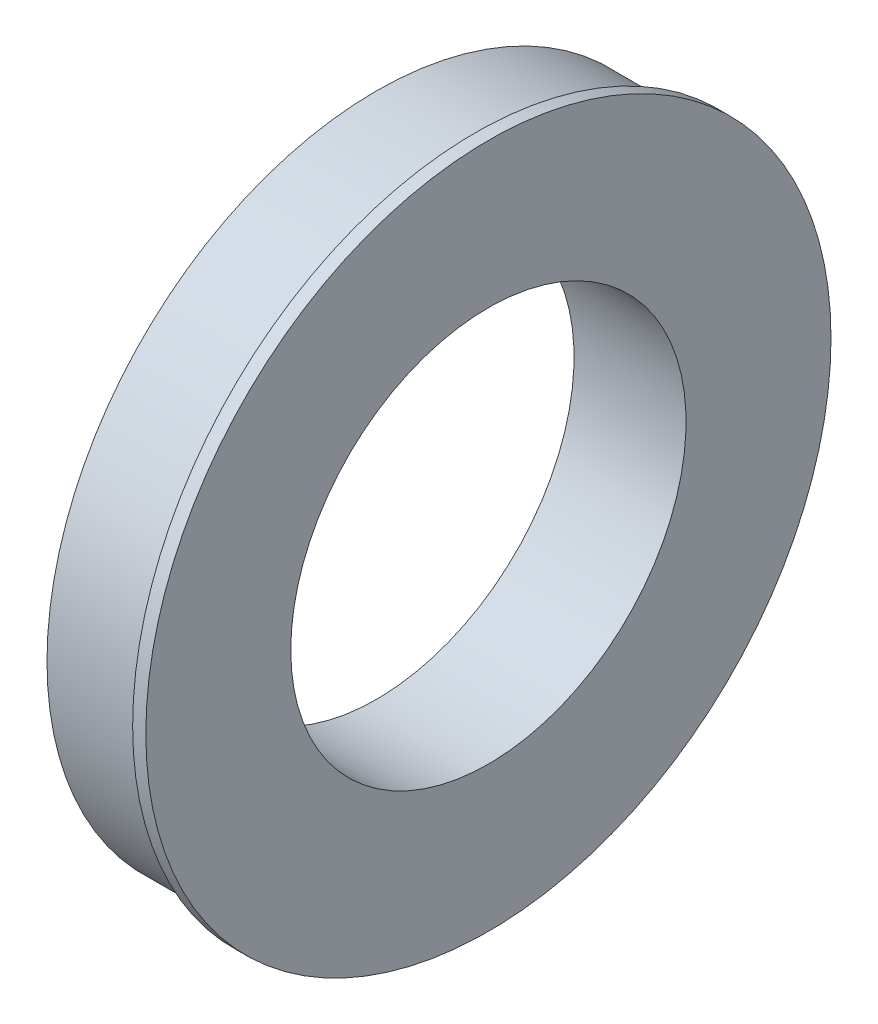
ISO-10303-21;
HEADER;
FILE_DESCRIPTION(('STEP AP214'),'2;1');
FILE_NAME('part.step','',(''),(''),'','','');
FILE_SCHEMA(('AUTOMOTIVE_DESIGN { 1 0 10303 214 1 1 1 1 }'));
ENDSEC;
DATA;
#1=APPLICATION_CONTEXT('core data for automotive mechanical design processes');
#2=APPLICATION_PROTOCOL_DEFINITION('international standard','automotive_design',2000,#1);
#3=PRODUCT_CONTEXT('',#1,'mechanical');
#4=PRODUCT('Part','Part','',(#3));
#5=PRODUCT_RELATED_PRODUCT_CATEGORY('part','',(#4));
#6=PRODUCT_DEFINITION_FORMATION('','',#4);
#7=PRODUCT_DEFINITION_CONTEXT('part definition',#1,'design');
#8=PRODUCT_DEFINITION('design','',#6,#7);
#9=PRODUCT_DEFINITION_SHAPE('','',#8);
#10=(LENGTH_UNIT() NAMED_UNIT(*) SI_UNIT(.MILLI.,.METRE.));
#11=(NAMED_UNIT(*) PLANE_ANGLE_UNIT() SI_UNIT($,.RADIAN.));
#12=(NAMED_UNIT(*) SI_UNIT($,.STERADIAN.) SOLID_ANGLE_UNIT());
#13=UNCERTAINTY_MEASURE_WITH_UNIT(LENGTH_MEASURE(1.E-05),#10,'distance_accuracy_value','');
#14=(GEOMETRIC_REPRESENTATION_CONTEXT(3) GLOBAL_UNCERTAINTY_ASSIGNED_CONTEXT((#13)) GLOBAL_UNIT_ASSIGNED_CONTEXT((#10,
#11,#12)) REPRESENTATION_CONTEXT('',''));
#15=CARTESIAN_POINT('',(0.,0.,0.));
#16=DIRECTION('',(0.,0.,1.));
#17=DIRECTION('',(1.,0.,0.));
#18=AXIS2_PLACEMENT_3D('',#15,#16,#17);
#19=CARTESIAN_POINT('',(0.,0.,0.));
#20=DIRECTION('',(1.,0.,0.));
#21=DIRECTION('',(0.,0.,-1.));
#22=AXIS2_PLACEMENT_3D('',#19,#20,#21);
#23=PLANE('',#22);
#24=CARTESIAN_POINT('',(0.,0.,0.));
#25=DIRECTION('',(1.,0.,0.));
#26=DIRECTION('',(0.,0.,-1.));
#27=AXIS2_PLACEMENT_3D('',#24,#25,#26);
#28=CIRCLE('',#27,63.5);
#29=CARTESIAN_POINT('',(0.,0.,63.5));
#30=VERTEX_POINT('',#29);
#31=EDGE_CURVE('E34',#30,#30,#28,.T.);
#32=ORIENTED_EDGE('',*,*,#31,.F.);
#33=EDGE_LOOP('',(#32));
#34=FACE_BOUND('',#33,.T.);
#35=CARTESIAN_POINT('',(0.,0.,0.));
#36=DIRECTION('',(1.,0.,0.));
#37=DIRECTION('',(0.,0.,-1.));
#38=AXIS2_PLACEMENT_3D('',#35,#36,#37);
#39=CIRCLE('',#38,38.1);
#40=CARTESIAN_POINT('',(0.,0.,38.1));
#41=VERTEX_POINT('',#40);
#42=EDGE_CURVE('E41',#41,#41,#39,.T.);
#43=ORIENTED_EDGE('',*,*,#42,.T.);
#44=EDGE_LOOP('',(#43));
#45=FACE_BOUND('',#44,.T.);
#46=ADVANCED_FACE('F30',(#34,#45),#23,.F.);
#47=CARTESIAN_POINT('',(19.05,0.,0.));
#48=DIRECTION('',(-1.,0.,0.));
#49=DIRECTION('',(0.,0.,1.));
#50=AXIS2_PLACEMENT_3D('',#47,#48,#49);
#51=CYLINDRICAL_SURFACE('',#50,63.5);
#52=CARTESIAN_POINT('',(19.05,0.,0.));
#53=DIRECTION('',(1.,0.,0.));
#54=DIRECTION('',(0.,0.,-1.));
#55=AXIS2_PLACEMENT_3D('',#52,#53,#54);
#56=CIRCLE('',#55,63.5);
#57=CARTESIAN_POINT('',(19.05,0.,63.5));
#58=VERTEX_POINT('',#57);
#59=EDGE_CURVE('E10',#58,#58,#56,.T.);
#60=CARTESIAN_POINT('',(19.05,0.,63.5));
#61=CARTESIAN_POINT('',(18.8515625,0.,63.5));
#62=CARTESIAN_POINT('',(18.653125,0.,63.5));
#63=CARTESIAN_POINT('',(18.25625,0.,63.5));
#64=CARTESIAN_POINT('',(18.0578125,0.,63.5));
#65=CARTESIAN_POINT('',(17.6609375,0.,63.5));
#66=CARTESIAN_POINT('',(17.4625,0.,63.5));
#67=CARTESIAN_POINT('',(17.065625,0.,63.5));
#68=CARTESIAN_POINT('',(16.8671875,0.,63.5));
#69=CARTESIAN_POINT('',(16.4703125,0.,63.5));
#70=CARTESIAN_POINT('',(16.271875,0.,63.5));
#71=CARTESIAN_POINT('',(15.875,0.,63.5));
#72=CARTESIAN_POINT('',(15.6765625,0.,63.5));
#73=CARTESIAN_POINT('',(15.2796875,0.,63.5));
#74=CARTESIAN_POINT('',(15.08125,0.,63.5));
#75=CARTESIAN_POINT('',(14.684375,0.,63.5));
#76=CARTESIAN_POINT('',(14.4859375,0.,63.5));
#77=CARTESIAN_POINT('',(14.0890625,0.,63.5));
#78=CARTESIAN_POINT('',(13.890625,0.,63.5));
#79=CARTESIAN_POINT('',(13.49375,0.,63.5));
#80=CARTESIAN_POINT('',(13.2953125,0.,63.5));
#81=CARTESIAN_POINT('',(12.8984375,0.,63.5));
#82=CARTESIAN_POINT('',(12.7,0.,63.5));
#83=CARTESIAN_POINT('',(12.303125,0.,63.5));
#84=CARTESIAN_POINT('',(12.1046875,0.,63.5));
#85=CARTESIAN_POINT('',(11.7078125,0.,63.5));
#86=CARTESIAN_POINT('',(11.509375,0.,63.5));
#87=CARTESIAN_POINT('',(11.1125,0.,63.5));
#88=CARTESIAN_POINT('',(10.9140625,0.,63.5));
#89=CARTESIAN_POINT('',(10.5171875,0.,63.5));
#90=CARTESIAN_POINT('',(10.31875,0.,63.5));
#91=CARTESIAN_POINT('',(9.921875,0.,63.5));
#92=CARTESIAN_POINT('',(9.7234375,0.,63.5));
#93=CARTESIAN_POINT('',(9.3265625,0.,63.5));
#94=CARTESIAN_POINT('',(9.128125,0.,63.5));
#95=CARTESIAN_POINT('',(8.73125,0.,63.5));
#96=CARTESIAN_POINT('',(8.5328125,0.,63.5));
#97=CARTESIAN_POINT('',(8.1359375,0.,63.5));
#98=CARTESIAN_POINT('',(7.9375,0.,63.5));
#99=CARTESIAN_POINT('',(7.540625,0.,63.5));
#100=CARTESIAN_POINT('',(7.3421875,0.,63.5));
#101=CARTESIAN_POINT('',(6.9453125,0.,63.5));
#102=CARTESIAN_POINT('',(6.746875,0.,63.5));
#103=CARTESIAN_POINT('',(6.35,0.,63.5));
#104=CARTESIAN_POINT('',(6.1515625,0.,63.5));
#105=CARTESIAN_POINT('',(5.7546875,0.,63.5));
#106=CARTESIAN_POINT('',(5.55625,0.,63.5));
#107=CARTESIAN_POINT('',(5.159375,0.,63.5));
#108=CARTESIAN_POINT('',(4.9609375,0.,63.5));
#109=CARTESIAN_POINT('',(4.5640625,0.,63.5));
#110=CARTESIAN_POINT('',(4.365625,0.,63.5));
#111=CARTESIAN_POINT('',(3.96875,0.,63.5));
#112=CARTESIAN_POINT('',(3.7703125,0.,63.5));
#113=CARTESIAN_POINT('',(3.3734375,0.,63.5));
#114=CARTESIAN_POINT('',(3.175,0.,63.5));
#115=CARTESIAN_POINT('',(2.778125,0.,63.5));
#116=CARTESIAN_POINT('',(2.5796875,0.,63.5));
#117=CARTESIAN_POINT('',(2.1828125,0.,63.5));
#118=CARTESIAN_POINT('',(1.984375,0.,63.5));
#119=CARTESIAN_POINT('',(1.5875,0.,63.5));
#120=CARTESIAN_POINT('',(1.3890625,0.,63.5));
#121=CARTESIAN_POINT('',(0.992187500000001,0.,63.5));
#122=CARTESIAN_POINT('',(0.793750000000001,0.,63.5));
#123=CARTESIAN_POINT('',(0.396875,0.,63.5));
#124=CARTESIAN_POINT('',(0.1984375,0.,63.5));
#125=CARTESIAN_POINT('',(0.,0.,63.5));
#126=B_SPLINE_CURVE_WITH_KNOTS('',3,(#60,#61,#62,#63,#64,#65,#66,#67,#68,#69,#70,#71,#72,#73,
#74,#75,#76,#77,#78,#79,#80,#81,#82,#83,#84,#85,#86,#87,#88,#89,#90,#91,#92,#93,#94,#95,#96,#97,
#98,#99,#100,#101,#102,#103,#104,#105,#106,#107,#108,#109,#110,#111,#112,#113,#114,#115,#116,
#117,#118,#119,#120,#121,#122,#123,#124,#125),.UNSPECIFIED.,.F.,.F.,(4,2,2,2,2,2,2,2,2,2,2,2,2,
2,2,2,2,2,2,2,2,2,2,2,2,2,2,2,2,2,2,2,4),(0.,0.5953125,1.190625,1.7859375,2.38125,2.9765625,
3.571875,4.1671875,4.7625,5.3578125,5.953125,6.5484375,7.14375,7.7390625,8.334375,8.9296875,
9.525,10.1203125,10.715625,11.3109375,11.90625,12.5015625,13.096875,13.6921875,14.2875,
14.8828125,15.478125,16.0734375,16.66875,17.2640625,17.859375,18.4546875,19.05),.UNSPECIFIED.);
#127=EDGE_CURVE('BSEAM32',#58,#30,#126,.T.);
#128=ORIENTED_EDGE('',*,*,#59,.F.);
#129=ORIENTED_EDGE('',*,*,#31,.T.);
#130=ORIENTED_EDGE('',*,*,#127,.T.);
#131=ORIENTED_EDGE('',*,*,#127,.F.);
#132=EDGE_LOOP('',(#128,#130,#129,#131));
#133=FACE_BOUND('',#132,.T.);
#134=ADVANCED_FACE('F32',(#133),#51,.T.);
#135=CARTESIAN_POINT('',(19.05,0.,0.));
#136=DIRECTION('',(-1.,0.,0.));
#137=DIRECTION('',(0.,0.,1.));
#138=AXIS2_PLACEMENT_3D('',#135,#136,#137);
#139=CYLINDRICAL_SURFACE('',#138,38.1);
#140=CARTESIAN_POINT('',(21.59,0.,0.));
#141=DIRECTION('',(1.,0.,0.));
#142=DIRECTION('',(0.,0.,-1.));
#143=AXIS2_PLACEMENT_3D('',#140,#141,#142);
#144=CIRCLE('',#143,38.1);
#145=CARTESIAN_POINT('',(21.59,0.,38.1));
#146=VERTEX_POINT('',#145);
#147=EDGE_CURVE('E49',#146,#146,#144,.T.);
#148=CARTESIAN_POINT('',(0.,0.,38.1));
#149=CARTESIAN_POINT('',(0.224895833333333,0.,38.1));
#150=CARTESIAN_POINT('',(0.449791666666667,0.,38.1));
#151=CARTESIAN_POINT('',(0.899583333333333,0.,38.1));
#152=CARTESIAN_POINT('',(1.12447916666667,0.,38.1));
#153=CARTESIAN_POINT('',(1.57427083333333,0.,38.1));
#154=CARTESIAN_POINT('',(1.79916666666667,0.,38.1));
#155=CARTESIAN_POINT('',(2.24895833333333,0.,38.1));
#156=CARTESIAN_POINT('',(2.47385416666667,0.,38.1));
#157=CARTESIAN_POINT('',(2.92364583333333,0.,38.1));
#158=CARTESIAN_POINT('',(3.14854166666667,0.,38.1));
#159=CARTESIAN_POINT('',(3.59833333333333,0.,38.1));
#160=CARTESIAN_POINT('',(3.82322916666667,0.,38.1));
#161=CARTESIAN_POINT('',(4.27302083333333,0.,38.1));
#162=CARTESIAN_POINT('',(4.49791666666667,0.,38.1));
#163=CARTESIAN_POINT('',(4.94770833333333,0.,38.1));
#164=CARTESIAN_POINT('',(5.17260416666667,0.,38.1));
#165=CARTESIAN_POINT('',(5.62239583333333,0.,38.1));
#166=CARTESIAN_POINT('',(5.84729166666667,0.,38.1));
#167=CARTESIAN_POINT('',(6.29708333333333,0.,38.1));
#168=CARTESIAN_POINT('',(6.52197916666667,0.,38.1));
#169=CARTESIAN_POINT('',(6.97177083333333,0.,38.1));
#170=CARTESIAN_POINT('',(7.19666666666667,0.,38.1));
#171=CARTESIAN_POINT('',(7.64645833333333,0.,38.1));
#172=CARTESIAN_POINT('',(7.87135416666667,0.,38.1));
#173=CARTESIAN_POINT('',(8.32114583333333,0.,38.1));
#174=CARTESIAN_POINT('',(8.54604166666667,0.,38.1));
#175=CARTESIAN_POINT('',(8.99583333333334,0.,38.1));
#176=CARTESIAN_POINT('',(9.22072916666667,0.,38.1));
#177=CARTESIAN_POINT('',(9.67052083333333,0.,38.1));
#178=CARTESIAN_POINT('',(9.89541666666667,0.,38.1));
#179=CARTESIAN_POINT('',(10.3452083333333,0.,38.1));
#180=CARTESIAN_POINT('',(10.5701041666667,0.,38.1));
#181=CARTESIAN_POINT('',(11.0198958333333,0.,38.1));
#182=CARTESIAN_POINT('',(11.2447916666667,0.,38.1));
#183=CARTESIAN_POINT('',(11.6945833333333,0.,38.1));
#184=CARTESIAN_POINT('',(11.9194791666667,0.,38.1));
#185=CARTESIAN_POINT('',(12.3692708333333,0.,38.1));
#186=CARTESIAN_POINT('',(12.5941666666667,0.,38.1));
#187=CARTESIAN_POINT('',(13.0439583333333,0.,38.1));
#188=CARTESIAN_POINT('',(13.2688541666667,0.,38.1));
#189=CARTESIAN_POINT('',(13.7186458333333,0.,38.1));
#190=CARTESIAN_POINT('',(13.9435416666667,0.,38.1));
#191=CARTESIAN_POINT('',(14.3933333333333,0.,38.1));
#192=CARTESIAN_POINT('',(14.6182291666667,0.,38.1));
#193=CARTESIAN_POINT('',(15.0680208333333,0.,38.1));
#194=CARTESIAN_POINT('',(15.2929166666667,0.,38.1));
#195=CARTESIAN_POINT('',(15.7427083333333,0.,38.1));
#196=CARTESIAN_POINT('',(15.9676041666667,0.,38.1));
#197=CARTESIAN_POINT('',(16.4173958333333,0.,38.1));
#198=CARTESIAN_POINT('',(16.6422916666667,0.,38.1));
#199=CARTESIAN_POINT('',(17.0920833333333,0.,38.1));
#200=CARTESIAN_POINT('',(17.3169791666667,0.,38.1));
#201=CARTESIAN_POINT('',(17.7667708333333,0.,38.1));
#202=CARTESIAN_POINT('',(17.9916666666667,0.,38.1));
#203=CARTESIAN_POINT('',(18.4414583333333,0.,38.1));
#204=CARTESIAN_POINT('',(18.6663541666667,0.,38.1));
#205=CARTESIAN_POINT('',(19.1161458333333,0.,38.1));
#206=CARTESIAN_POINT('',(19.3410416666667,0.,38.1));
#207=CARTESIAN_POINT('',(19.7908333333333,0.,38.1));
#208=CARTESIAN_POINT('',(20.0157291666667,0.,38.1));
#209=CARTESIAN_POINT('',(20.4655208333333,0.,38.1));
#210=CARTESIAN_POINT('',(20.6904166666667,0.,38.1));
#211=CARTESIAN_POINT('',(21.1402083333333,0.,38.1));
#212=CARTESIAN_POINT('',(21.3651041666667,0.,38.1));
#213=CARTESIAN_POINT('',(21.59,0.,38.1));
#214=B_SPLINE_CURVE_WITH_KNOTS('',3,(#148,#149,#150,#151,#152,#153,#154,#155,#156,#157,#158,
#159,#160,#161,#162,#163,#164,#165,#166,#167,#168,#169,#170,#171,#172,#173,#174,#175,#176,#177,
#178,#179,#180,#181,#182,#183,#184,#185,#186,#187,#188,#189,#190,#191,#192,#193,#194,#195,#196,
#197,#198,#199,#200,#201,#202,#203,#204,#205,#206,#207,#208,#209,#210,#211,#212,#213),
.UNSPECIFIED.,.F.,.F.,(4,2,2,2,2,2,2,2,2,2,2,2,2,2,2,2,2,2,2,2,2,2,2,2,2,2,2,2,2,2,2,2,4),(0.,
0.6746875,1.349375,2.0240625,2.69875,3.3734375,4.048125,4.7228125,5.3975,6.0721875,6.746875,
7.4215625,8.09625,8.7709375,9.445625,10.1203125,10.795,11.4696875,12.144375,12.8190625,13.49375,
14.1684375,14.843125,15.5178125,16.1925,16.8671875,17.541875,18.2165625,18.89125,19.5659375,
20.240625,20.9153125,21.59),.UNSPECIFIED.);
#215=EDGE_CURVE('BSEAM55',#41,#146,#214,.T.);
#216=ORIENTED_EDGE('',*,*,#42,.F.);
#217=ORIENTED_EDGE('',*,*,#147,.T.);
#218=ORIENTED_EDGE('',*,*,#215,.T.);
#219=ORIENTED_EDGE('',*,*,#215,.F.);
#220=EDGE_LOOP('',(#216,#218,#217,#219));
#221=FACE_BOUND('',#220,.T.);
#222=ADVANCED_FACE('F55',(#221),#139,.F.);
#223=CARTESIAN_POINT('',(21.59,0.,0.));
#224=DIRECTION('',(1.,0.,0.));
#225=DIRECTION('',(0.,0.,-1.));
#226=AXIS2_PLACEMENT_3D('',#223,#224,#225);
#227=PLANE('',#226);
#228=CARTESIAN_POINT('',(21.59,0.,0.));
#229=DIRECTION('',(1.,0.,0.));
#230=DIRECTION('',(0.,0.,-1.));
#231=AXIS2_PLACEMENT_3D('',#228,#229,#230);
#232=CIRCLE('',#231,66.04);
#233=CARTESIAN_POINT('',(21.59,0.,-66.04));
#234=VERTEX_POINT('',#233);
#235=EDGE_CURVE('E45',#234,#234,#232,.T.);
#236=ORIENTED_EDGE('',*,*,#235,.T.);
#237=EDGE_LOOP('',(#236));
#238=FACE_BOUND('',#237,.T.);
#239=ORIENTED_EDGE('',*,*,#147,.F.);
#240=EDGE_LOOP('',(#239));
#241=FACE_BOUND('',#240,.T.);
#242=ADVANCED_FACE('F57',(#238,#241),#227,.T.);
#243=CARTESIAN_POINT('',(19.05,0.,0.));
#244=DIRECTION('',(1.,0.,0.));
#245=DIRECTION('',(0.,0.,-1.));
#246=AXIS2_PLACEMENT_3D('',#243,#244,#245);
#247=PLANE('',#246);
#248=ORIENTED_EDGE('',*,*,#59,.T.);
#249=EDGE_LOOP('',(#248));
#250=FACE_BOUND('',#249,.T.);
#251=CARTESIAN_POINT('',(19.05,0.,0.));
#252=DIRECTION('',(1.,0.,0.));
#253=DIRECTION('',(0.,0.,-1.));
#254=AXIS2_PLACEMENT_3D('',#251,#252,#253);
#255=CIRCLE('',#254,66.04);
#256=CARTESIAN_POINT('',(19.05,0.,-66.04));
#257=VERTEX_POINT('',#256);
#258=EDGE_CURVE('E46',#257,#257,#255,.T.);
#259=ORIENTED_EDGE('',*,*,#258,.F.);
#260=EDGE_LOOP('',(#259));
#261=FACE_BOUND('',#260,.T.);
#262=ADVANCED_FACE('F59',(#250,#261),#247,.F.);
#263=CARTESIAN_POINT('',(21.59,0.,0.));
#264=DIRECTION('',(-1.,0.,0.));
#265=DIRECTION('',(0.,0.,1.));
#266=AXIS2_PLACEMENT_3D('',#263,#264,#265);
#267=CYLINDRICAL_SURFACE('',#266,66.04);
#268=ORIENTED_EDGE('',*,*,#235,.F.);
#269=EDGE_LOOP('',(#268));
#270=FACE_BOUND('',#269,.T.);
#271=ORIENTED_EDGE('',*,*,#258,.T.);
#272=EDGE_LOOP('',(#271));
#273=FACE_BOUND('',#272,.T.);
#274=ADVANCED_FACE('F66',(#270,#273),#267,.T.);
#275=CLOSED_SHELL('',(#46,#134,#222,#242,#262,#274));
#276=MANIFOLD_SOLID_BREP('B2',#275);
#277=ADVANCED_BREP_SHAPE_REPRESENTATION('',(#18,#276),#14);
#278=SHAPE_DEFINITION_REPRESENTATION(#9,#277);
ENDSEC;
END-ISO-10303-21;
